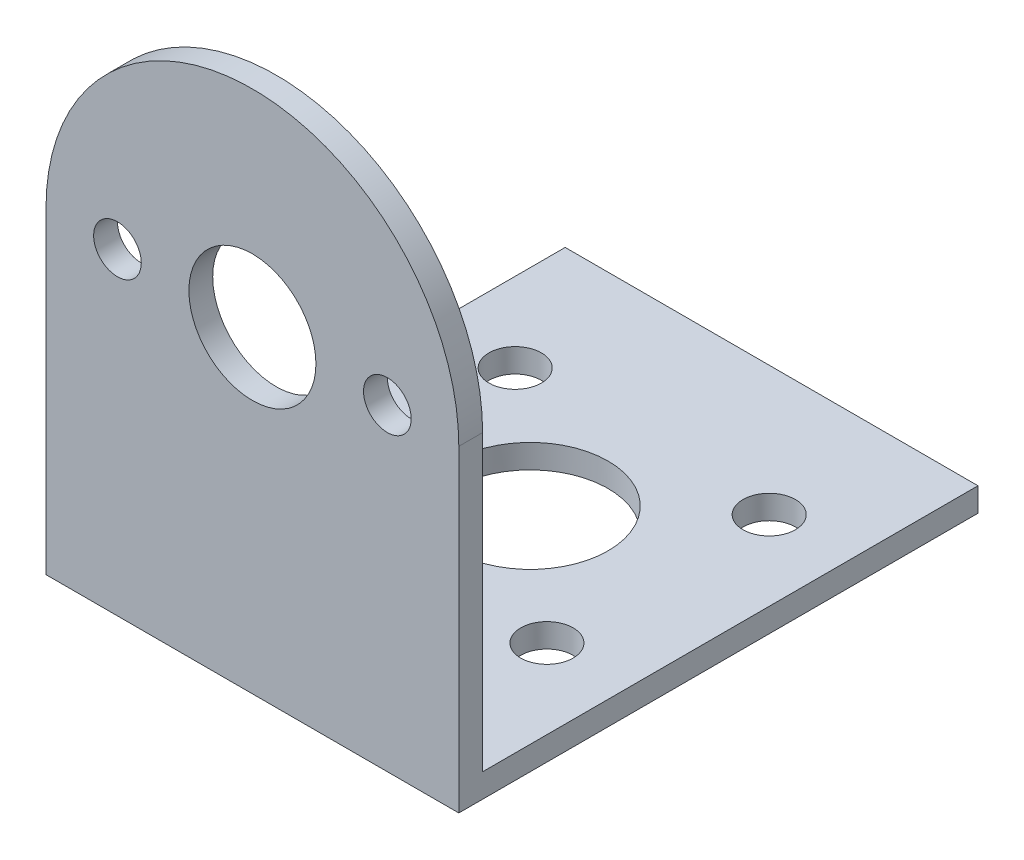
ISO-10303-21;
HEADER;
FILE_DESCRIPTION(('STEP AP214'),'2;1');
FILE_NAME('part.step','',(''),(''),'','','');
FILE_SCHEMA(('AUTOMOTIVE_DESIGN { 1 0 10303 214 1 1 1 1 }'));
ENDSEC;
DATA;
#1=APPLICATION_CONTEXT('core data for automotive mechanical design processes');
#2=APPLICATION_PROTOCOL_DEFINITION('international standard','automotive_design',2000,#1);
#3=PRODUCT_CONTEXT('',#1,'mechanical');
#4=PRODUCT('Part','Part','',(#3));
#5=PRODUCT_RELATED_PRODUCT_CATEGORY('part','',(#4));
#6=PRODUCT_DEFINITION_FORMATION('','',#4);
#7=PRODUCT_DEFINITION_CONTEXT('part definition',#1,'design');
#8=PRODUCT_DEFINITION('design','',#6,#7);
#9=PRODUCT_DEFINITION_SHAPE('','',#8);
#10=(LENGTH_UNIT() NAMED_UNIT(*) SI_UNIT(.MILLI.,.METRE.));
#11=(NAMED_UNIT(*) PLANE_ANGLE_UNIT() SI_UNIT($,.RADIAN.));
#12=(NAMED_UNIT(*) SI_UNIT($,.STERADIAN.) SOLID_ANGLE_UNIT());
#13=UNCERTAINTY_MEASURE_WITH_UNIT(LENGTH_MEASURE(1.E-05),#10,'distance_accuracy_value','');
#14=(GEOMETRIC_REPRESENTATION_CONTEXT(3) GLOBAL_UNCERTAINTY_ASSIGNED_CONTEXT((#13)) GLOBAL_UNIT_ASSIGNED_CONTEXT((#10,
#11,#12)) REPRESENTATION_CONTEXT('',''));
#15=CARTESIAN_POINT('',(0.,0.,0.));
#16=DIRECTION('',(0.,0.,1.));
#17=DIRECTION('',(1.,0.,0.));
#18=AXIS2_PLACEMENT_3D('',#15,#16,#17);
#19=CARTESIAN_POINT('',(0.,-16.7,-29.7));
#20=DIRECTION('',(0.,0.,-1.));
#21=DIRECTION('',(-1.,0.,0.));
#22=AXIS2_PLACEMENT_3D('',#19,#20,#21);
#23=PLANE('',#22);
#24=DIRECTION('',(0.,-1.,0.));
#25=VECTOR('',#24,1.);
#26=CARTESIAN_POINT('',(-13.,-16.7,-29.7));
#27=LINE('',#26,#25);
#28=CARTESIAN_POINT('',(-13.,-18.5,-29.7));
#29=VERTEX_POINT('',#28);
#30=CARTESIAN_POINT('',(-13.,-20.,-29.7));
#31=VERTEX_POINT('',#30);
#32=EDGE_CURVE('E161',#29,#31,#27,.T.);
#33=ORIENTED_EDGE('',*,*,#32,.F.);
#34=DIRECTION('',(-1.,0.,0.));
#35=VECTOR('',#34,1.);
#36=CARTESIAN_POINT('',(13.,-18.5,-29.7));
#37=LINE('',#36,#35);
#38=CARTESIAN_POINT('',(13.,-18.5,-29.7));
#39=VERTEX_POINT('',#38);
#40=EDGE_CURVE('E133',#39,#29,#37,.T.);
#41=ORIENTED_EDGE('',*,*,#40,.F.);
#42=DIRECTION('',(0.,-1.,0.));
#43=VECTOR('',#42,1.);
#44=CARTESIAN_POINT('',(13.,-16.7,-29.7));
#45=LINE('',#44,#43);
#46=CARTESIAN_POINT('',(13.,-20.,-29.7));
#47=VERTEX_POINT('',#46);
#48=EDGE_CURVE('E162',#39,#47,#45,.T.);
#49=ORIENTED_EDGE('',*,*,#48,.T.);
#50=DIRECTION('',(1.,0.,0.));
#51=VECTOR('',#50,1.);
#52=CARTESIAN_POINT('',(0.,-20.,-29.7));
#53=LINE('',#52,#51);
#54=EDGE_CURVE('E155',#31,#47,#53,.T.);
#55=ORIENTED_EDGE('',*,*,#54,.F.);
#56=EDGE_LOOP('',(#33,#41,#49,#55));
#57=FACE_BOUND('',#56,.T.);
#58=ADVANCED_FACE('F37',(#57),#23,.T.);
#59=CARTESIAN_POINT('',(-8.,-16.7,-21.55));
#60=DIRECTION('',(0.,-1.,0.));
#61=DIRECTION('',(1.,0.,0.));
#62=AXIS2_PLACEMENT_3D('',#59,#60,#61);
#63=CYLINDRICAL_SURFACE('',#62,1.65);
#64=CARTESIAN_POINT('',(-8.,-20.,-21.55));
#65=DIRECTION('',(0.,-1.,0.));
#66=DIRECTION('',(1.,0.,0.));
#67=AXIS2_PLACEMENT_3D('',#64,#65,#66);
#68=CIRCLE('',#67,1.65);
#69=CARTESIAN_POINT('',(-6.35,-20.,-21.55));
#70=VERTEX_POINT('',#69);
#71=EDGE_CURVE('E152',#70,#70,#68,.T.);
#72=ORIENTED_EDGE('',*,*,#71,.T.);
#73=EDGE_LOOP('',(#72));
#74=FACE_BOUND('',#73,.T.);
#75=CARTESIAN_POINT('',(-8.,-18.5,-21.55));
#76=DIRECTION('',(0.,1.,0.));
#77=DIRECTION('',(-1.,0.,0.));
#78=AXIS2_PLACEMENT_3D('',#75,#76,#77);
#79=CIRCLE('',#78,1.65);
#80=CARTESIAN_POINT('',(-9.65,-18.5,-21.55));
#81=VERTEX_POINT('',#80);
#82=EDGE_CURVE('E118',#81,#81,#79,.T.);
#83=ORIENTED_EDGE('',*,*,#82,.T.);
#84=EDGE_LOOP('',(#83));
#85=FACE_BOUND('',#84,.T.);
#86=ADVANCED_FACE('F226',(#74,#85),#63,.F.);
#87=CARTESIAN_POINT('',(-8.,-16.7,-7.55));
#88=DIRECTION('',(0.,-1.,0.));
#89=DIRECTION('',(1.,0.,0.));
#90=AXIS2_PLACEMENT_3D('',#87,#88,#89);
#91=CYLINDRICAL_SURFACE('',#90,1.65);
#92=CARTESIAN_POINT('',(-8.,-20.,-7.55));
#93=DIRECTION('',(0.,-1.,0.));
#94=DIRECTION('',(1.,0.,0.));
#95=AXIS2_PLACEMENT_3D('',#92,#93,#94);
#96=CIRCLE('',#95,1.65);
#97=CARTESIAN_POINT('',(-6.35,-20.,-7.55));
#98=VERTEX_POINT('',#97);
#99=EDGE_CURVE('E149',#98,#98,#96,.T.);
#100=ORIENTED_EDGE('',*,*,#99,.T.);
#101=EDGE_LOOP('',(#100));
#102=FACE_BOUND('',#101,.T.);
#103=CARTESIAN_POINT('',(-8.,-18.5,-7.55));
#104=DIRECTION('',(0.,1.,0.));
#105=DIRECTION('',(-1.,0.,0.));
#106=AXIS2_PLACEMENT_3D('',#103,#104,#105);
#107=CIRCLE('',#106,1.65);
#108=CARTESIAN_POINT('',(-9.65000000000001,-18.5,-7.55));
#109=VERTEX_POINT('',#108);
#110=EDGE_CURVE('E127',#109,#109,#107,.T.);
#111=ORIENTED_EDGE('',*,*,#110,.T.);
#112=EDGE_LOOP('',(#111));
#113=FACE_BOUND('',#112,.T.);
#114=ADVANCED_FACE('F221',(#102,#113),#91,.F.);
#115=CARTESIAN_POINT('',(8.,-16.7,-7.55000000000001));
#116=DIRECTION('',(0.,-1.,0.));
#117=DIRECTION('',(1.,0.,0.));
#118=AXIS2_PLACEMENT_3D('',#115,#116,#117);
#119=CYLINDRICAL_SURFACE('',#118,1.65);
#120=CARTESIAN_POINT('',(8.,-20.,-7.55000000000001));
#121=DIRECTION('',(0.,-1.,0.));
#122=DIRECTION('',(1.,0.,0.));
#123=AXIS2_PLACEMENT_3D('',#120,#121,#122);
#124=CIRCLE('',#123,1.65);
#125=CARTESIAN_POINT('',(9.65,-20.,-7.55000000000001));
#126=VERTEX_POINT('',#125);
#127=EDGE_CURVE('E146',#126,#126,#124,.F.);
#128=ORIENTED_EDGE('',*,*,#127,.F.);
#129=EDGE_LOOP('',(#128));
#130=FACE_BOUND('',#129,.T.);
#131=CARTESIAN_POINT('',(7.99999999999999,-18.5,-7.55000000000001));
#132=DIRECTION('',(0.,1.,0.));
#133=DIRECTION('',(-1.,0.,0.));
#134=AXIS2_PLACEMENT_3D('',#131,#132,#133);
#135=CIRCLE('',#134,1.65);
#136=CARTESIAN_POINT('',(6.34999999999999,-18.5,-7.55000000000001));
#137=VERTEX_POINT('',#136);
#138=EDGE_CURVE('E124',#137,#137,#135,.T.);
#139=ORIENTED_EDGE('',*,*,#138,.T.);
#140=EDGE_LOOP('',(#139));
#141=FACE_BOUND('',#140,.T.);
#142=ADVANCED_FACE('F212',(#130,#141),#119,.F.);
#143=CARTESIAN_POINT('',(0.,-16.7,-14.5));
#144=DIRECTION('',(0.,-1.,0.));
#145=DIRECTION('',(1.,0.,0.));
#146=AXIS2_PLACEMENT_3D('',#143,#144,#145);
#147=CYLINDRICAL_SURFACE('',#146,4.9);
#148=CARTESIAN_POINT('',(0.,-20.,-14.5));
#149=DIRECTION('',(0.,-1.,0.));
#150=DIRECTION('',(1.,0.,0.));
#151=AXIS2_PLACEMENT_3D('',#148,#149,#150);
#152=CIRCLE('',#151,4.9);
#153=CARTESIAN_POINT('',(4.9,-20.,-14.5));
#154=VERTEX_POINT('',#153);
#155=EDGE_CURVE('E143',#154,#154,#152,.T.);
#156=ORIENTED_EDGE('',*,*,#155,.T.);
#157=EDGE_LOOP('',(#156));
#158=FACE_BOUND('',#157,.T.);
#159=CARTESIAN_POINT('',(0.,-18.5,-14.5));
#160=DIRECTION('',(0.,1.,0.));
#161=DIRECTION('',(-1.,0.,0.));
#162=AXIS2_PLACEMENT_3D('',#159,#160,#161);
#163=CIRCLE('',#162,4.9);
#164=CARTESIAN_POINT('',(-4.9,-18.5,-14.5));
#165=VERTEX_POINT('',#164);
#166=EDGE_CURVE('E130',#165,#165,#163,.T.);
#167=ORIENTED_EDGE('',*,*,#166,.T.);
#168=EDGE_LOOP('',(#167));
#169=FACE_BOUND('',#168,.T.);
#170=ADVANCED_FACE('F209',(#158,#169),#147,.F.);
#171=CARTESIAN_POINT('',(8.,-16.7,-21.55));
#172=DIRECTION('',(0.,-1.,0.));
#173=DIRECTION('',(1.,0.,0.));
#174=AXIS2_PLACEMENT_3D('',#171,#172,#173);
#175=CYLINDRICAL_SURFACE('',#174,1.65);
#176=CARTESIAN_POINT('',(8.,-20.,-21.55));
#177=DIRECTION('',(0.,-1.,0.));
#178=DIRECTION('',(1.,0.,0.));
#179=AXIS2_PLACEMENT_3D('',#176,#177,#178);
#180=CIRCLE('',#179,1.65);
#181=CARTESIAN_POINT('',(9.65,-20.,-21.55));
#182=VERTEX_POINT('',#181);
#183=EDGE_CURVE('E158',#182,#182,#180,.F.);
#184=ORIENTED_EDGE('',*,*,#183,.F.);
#185=EDGE_LOOP('',(#184));
#186=FACE_BOUND('',#185,.T.);
#187=CARTESIAN_POINT('',(8.,-18.5,-21.55));
#188=DIRECTION('',(0.,1.,0.));
#189=DIRECTION('',(-1.,0.,0.));
#190=AXIS2_PLACEMENT_3D('',#187,#188,#189);
#191=CIRCLE('',#190,1.65);
#192=CARTESIAN_POINT('',(6.35,-18.5,-21.55));
#193=VERTEX_POINT('',#192);
#194=EDGE_CURVE('E121',#193,#193,#191,.T.);
#195=ORIENTED_EDGE('',*,*,#194,.T.);
#196=EDGE_LOOP('',(#195));
#197=FACE_BOUND('',#196,.T.);
#198=ADVANCED_FACE('F211',(#186,#197),#175,.F.);
#199=CARTESIAN_POINT('',(0.,0.,3.));
#200=DIRECTION('',(0.,0.,-1.));
#201=DIRECTION('',(-1.,0.,0.));
#202=AXIS2_PLACEMENT_3D('',#199,#200,#201);
#203=CYLINDRICAL_SURFACE('',#202,13.);
#204=DIRECTION('',(0.,0.,-1.));
#205=VECTOR('',#204,1.);
#206=CARTESIAN_POINT('',(13.,0.,3.));
#207=LINE('',#206,#205);
#208=CARTESIAN_POINT('',(13.,0.,3.));
#209=VERTEX_POINT('',#208);
#210=CARTESIAN_POINT('',(13.,0.,1.5));
#211=VERTEX_POINT('',#210);
#212=EDGE_CURVE('E11',#209,#211,#207,.T.);
#213=ORIENTED_EDGE('',*,*,#212,.T.);
#214=CARTESIAN_POINT('',(0.,0.,1.5));
#215=DIRECTION('',(0.,0.,-1.));
#216=DIRECTION('',(-1.,0.,0.));
#217=AXIS2_PLACEMENT_3D('',#214,#215,#216);
#218=CIRCLE('',#217,13.);
#219=CARTESIAN_POINT('',(-13.,0.,1.5));
#220=VERTEX_POINT('',#219);
#221=EDGE_CURVE('E91',#220,#211,#218,.T.);
#222=ORIENTED_EDGE('',*,*,#221,.F.);
#223=DIRECTION('',(0.,0.,-1.));
#224=VECTOR('',#223,1.);
#225=CARTESIAN_POINT('',(-13.,0.,3.));
#226=LINE('',#225,#224);
#227=CARTESIAN_POINT('',(-13.,0.,3.));
#228=VERTEX_POINT('',#227);
#229=EDGE_CURVE('E45',#228,#220,#226,.T.);
#230=ORIENTED_EDGE('',*,*,#229,.F.);
#231=CARTESIAN_POINT('',(0.,0.,3.));
#232=DIRECTION('',(0.,0.,1.));
#233=DIRECTION('',(1.,0.,0.));
#234=AXIS2_PLACEMENT_3D('',#231,#232,#233);
#235=CIRCLE('',#234,13.);
#236=EDGE_CURVE('E93',#209,#228,#235,.T.);
#237=ORIENTED_EDGE('',*,*,#236,.F.);
#238=EDGE_LOOP('',(#213,#222,#230,#237));
#239=FACE_BOUND('',#238,.T.);
#240=ADVANCED_FACE('F88',(#239),#203,.T.);
#241=CARTESIAN_POINT('',(0.,0.,3.));
#242=DIRECTION('',(0.,0.,-1.));
#243=DIRECTION('',(-1.,0.,0.));
#244=AXIS2_PLACEMENT_3D('',#241,#242,#243);
#245=CYLINDRICAL_SURFACE('',#244,4.);
#246=CARTESIAN_POINT('',(0.,0.,3.));
#247=DIRECTION('',(0.,0.,1.));
#248=DIRECTION('',(1.,0.,0.));
#249=AXIS2_PLACEMENT_3D('',#246,#247,#248);
#250=CIRCLE('',#249,4.);
#251=CARTESIAN_POINT('',(4.,0.,3.));
#252=VERTEX_POINT('',#251);
#253=EDGE_CURVE('E164',#252,#252,#250,.T.);
#254=ORIENTED_EDGE('',*,*,#253,.T.);
#255=EDGE_LOOP('',(#254));
#256=FACE_BOUND('',#255,.T.);
#257=CARTESIAN_POINT('',(0.,0.,1.5));
#258=DIRECTION('',(0.,0.,-1.));
#259=DIRECTION('',(-1.,0.,0.));
#260=AXIS2_PLACEMENT_3D('',#257,#258,#259);
#261=CIRCLE('',#260,4.);
#262=CARTESIAN_POINT('',(-4.,0.,1.5));
#263=VERTEX_POINT('',#262);
#264=EDGE_CURVE('E109',#263,#263,#261,.T.);
#265=ORIENTED_EDGE('',*,*,#264,.T.);
#266=EDGE_LOOP('',(#265));
#267=FACE_BOUND('',#266,.T.);
#268=ADVANCED_FACE('F39',(#256,#267),#245,.F.);
#269=CARTESIAN_POINT('',(-8.5,0.,1.5));
#270=DIRECTION('',(0.,0.,-1.));
#271=DIRECTION('',(-1.,0.,0.));
#272=AXIS2_PLACEMENT_3D('',#269,#270,#271);
#273=CYLINDRICAL_SURFACE('',#272,1.5);
#274=CARTESIAN_POINT('',(-8.5,0.,3.));
#275=DIRECTION('',(0.,0.,1.));
#276=DIRECTION('',(1.,0.,0.));
#277=AXIS2_PLACEMENT_3D('',#274,#275,#276);
#278=CIRCLE('',#277,1.5);
#279=CARTESIAN_POINT('',(-7.,0.,3.));
#280=VERTEX_POINT('',#279);
#281=EDGE_CURVE('E140',#280,#280,#278,.T.);
#282=ORIENTED_EDGE('',*,*,#281,.T.);
#283=EDGE_LOOP('',(#282));
#284=FACE_BOUND('',#283,.T.);
#285=CARTESIAN_POINT('',(-8.5,0.,1.5));
#286=DIRECTION('',(0.,0.,-1.));
#287=DIRECTION('',(-1.,0.,0.));
#288=AXIS2_PLACEMENT_3D('',#285,#286,#287);
#289=CIRCLE('',#288,1.5);
#290=CARTESIAN_POINT('',(-10.,0.,1.5));
#291=VERTEX_POINT('',#290);
#292=EDGE_CURVE('E275',#291,#291,#289,.T.);
#293=ORIENTED_EDGE('',*,*,#292,.T.);
#294=EDGE_LOOP('',(#293));
#295=FACE_BOUND('',#294,.T.);
#296=ADVANCED_FACE('F264',(#284,#295),#273,.F.);
#297=CARTESIAN_POINT('',(8.5,0.,1.5));
#298=DIRECTION('',(0.,0.,-1.));
#299=DIRECTION('',(-1.,0.,0.));
#300=AXIS2_PLACEMENT_3D('',#297,#298,#299);
#301=CYLINDRICAL_SURFACE('',#300,1.5);
#302=CARTESIAN_POINT('',(8.5,0.,3.));
#303=DIRECTION('',(0.,0.,1.));
#304=DIRECTION('',(1.,0.,0.));
#305=AXIS2_PLACEMENT_3D('',#302,#303,#304);
#306=CIRCLE('',#305,1.5);
#307=CARTESIAN_POINT('',(10.,0.,3.));
#308=VERTEX_POINT('',#307);
#309=EDGE_CURVE('E137',#308,#308,#306,.T.);
#310=ORIENTED_EDGE('',*,*,#309,.T.);
#311=EDGE_LOOP('',(#310));
#312=FACE_BOUND('',#311,.T.);
#313=CARTESIAN_POINT('',(8.5,0.,1.5));
#314=DIRECTION('',(0.,0.,-1.));
#315=DIRECTION('',(-1.,0.,0.));
#316=AXIS2_PLACEMENT_3D('',#313,#314,#315);
#317=CIRCLE('',#316,1.5);
#318=CARTESIAN_POINT('',(7.,0.,1.5));
#319=VERTEX_POINT('',#318);
#320=EDGE_CURVE('E112',#319,#319,#317,.T.);
#321=ORIENTED_EDGE('',*,*,#320,.T.);
#322=EDGE_LOOP('',(#321));
#323=FACE_BOUND('',#322,.T.);
#324=ADVANCED_FACE('F260',(#312,#323),#301,.F.);
#325=CARTESIAN_POINT('',(13.,0.,3.));
#326=DIRECTION('',(1.,0.,0.));
#327=DIRECTION('',(0.,1.,0.));
#328=AXIS2_PLACEMENT_3D('',#325,#326,#327);
#329=PLANE('',#328);
#330=DIRECTION('',(0.,0.,-1.));
#331=VECTOR('',#330,1.);
#332=CARTESIAN_POINT('',(13.,-18.5,1.8));
#333=LINE('',#332,#331);
#334=CARTESIAN_POINT('',(13.,-18.5,1.5));
#335=VERTEX_POINT('',#334);
#336=EDGE_CURVE('E101',#335,#39,#333,.T.);
#337=ORIENTED_EDGE('',*,*,#336,.F.);
#338=DIRECTION('',(0.,-1.,0.));
#339=VECTOR('',#338,1.);
#340=CARTESIAN_POINT('',(13.,0.,1.5));
#341=LINE('',#340,#339);
#342=EDGE_CURVE('E98',#211,#335,#341,.T.);
#343=ORIENTED_EDGE('',*,*,#342,.F.);
#344=ORIENTED_EDGE('',*,*,#212,.F.);
#345=DIRECTION('',(0.,-1.,0.));
#346=VECTOR('',#345,1.);
#347=CARTESIAN_POINT('',(13.,0.,3.));
#348=LINE('',#347,#346);
#349=CARTESIAN_POINT('',(13.,-20.,3.));
#350=VERTEX_POINT('',#349);
#351=EDGE_CURVE('E168',#209,#350,#348,.T.);
#352=ORIENTED_EDGE('',*,*,#351,.T.);
#353=DIRECTION('',(0.,0.,-1.));
#354=VECTOR('',#353,1.);
#355=CARTESIAN_POINT('',(13.,-20.,3.));
#356=LINE('',#355,#354);
#357=EDGE_CURVE('E176',#350,#47,#356,.T.);
#358=ORIENTED_EDGE('',*,*,#357,.T.);
#359=ORIENTED_EDGE('',*,*,#48,.F.);
#360=EDGE_LOOP('',(#337,#343,#344,#352,#358,#359));
#361=FACE_BOUND('',#360,.T.);
#362=ADVANCED_FACE('F99',(#361),#329,.T.);
#363=CARTESIAN_POINT('',(-13.,0.,3.));
#364=DIRECTION('',(1.,0.,0.));
#365=DIRECTION('',(0.,1.,0.));
#366=AXIS2_PLACEMENT_3D('',#363,#364,#365);
#367=PLANE('',#366);
#368=ORIENTED_EDGE('',*,*,#229,.T.);
#369=DIRECTION('',(0.,1.,0.));
#370=VECTOR('',#369,1.);
#371=CARTESIAN_POINT('',(-13.,-18.5,1.5));
#372=LINE('',#371,#370);
#373=CARTESIAN_POINT('',(-13.,-18.5,1.5));
#374=VERTEX_POINT('',#373);
#375=EDGE_CURVE('E108',#374,#220,#372,.T.);
#376=ORIENTED_EDGE('',*,*,#375,.F.);
#377=DIRECTION('',(0.,0.,1.));
#378=VECTOR('',#377,1.);
#379=CARTESIAN_POINT('',(-13.,-18.5,-29.7));
#380=LINE('',#379,#378);
#381=EDGE_CURVE('E57',#29,#374,#380,.T.);
#382=ORIENTED_EDGE('',*,*,#381,.F.);
#383=ORIENTED_EDGE('',*,*,#32,.T.);
#384=DIRECTION('',(0.,0.,-1.));
#385=VECTOR('',#384,1.);
#386=CARTESIAN_POINT('',(-13.,-20.,3.));
#387=LINE('',#386,#385);
#388=CARTESIAN_POINT('',(-13.,-20.,3.));
#389=VERTEX_POINT('',#388);
#390=EDGE_CURVE('E179',#389,#31,#387,.T.);
#391=ORIENTED_EDGE('',*,*,#390,.F.);
#392=DIRECTION('',(0.,-1.,0.));
#393=VECTOR('',#392,1.);
#394=CARTESIAN_POINT('',(-13.,0.,3.));
#395=LINE('',#394,#393);
#396=EDGE_CURVE('E171',#228,#389,#395,.T.);
#397=ORIENTED_EDGE('',*,*,#396,.F.);
#398=EDGE_LOOP('',(#368,#376,#382,#383,#391,#397));
#399=FACE_BOUND('',#398,.T.);
#400=ADVANCED_FACE('F182',(#399),#367,.F.);
#401=CARTESIAN_POINT('',(0.,-20.,3.));
#402=DIRECTION('',(0.,1.,0.));
#403=DIRECTION('',(0.,0.,1.));
#404=AXIS2_PLACEMENT_3D('',#401,#402,#403);
#405=PLANE('',#404);
#406=ORIENTED_EDGE('',*,*,#390,.T.);
#407=ORIENTED_EDGE('',*,*,#54,.T.);
#408=ORIENTED_EDGE('',*,*,#357,.F.);
#409=DIRECTION('',(1.,0.,0.));
#410=VECTOR('',#409,1.);
#411=CARTESIAN_POINT('',(0.,-20.,3.));
#412=LINE('',#411,#410);
#413=EDGE_CURVE('E174',#389,#350,#412,.T.);
#414=ORIENTED_EDGE('',*,*,#413,.F.);
#415=EDGE_LOOP('',(#406,#407,#408,#414));
#416=FACE_BOUND('',#415,.T.);
#417=ORIENTED_EDGE('',*,*,#155,.F.);
#418=EDGE_LOOP('',(#417));
#419=FACE_BOUND('',#418,.T.);
#420=ORIENTED_EDGE('',*,*,#127,.T.);
#421=EDGE_LOOP('',(#420));
#422=FACE_BOUND('',#421,.T.);
#423=ORIENTED_EDGE('',*,*,#99,.F.);
#424=EDGE_LOOP('',(#423));
#425=FACE_BOUND('',#424,.T.);
#426=ORIENTED_EDGE('',*,*,#71,.F.);
#427=EDGE_LOOP('',(#426));
#428=FACE_BOUND('',#427,.T.);
#429=ORIENTED_EDGE('',*,*,#183,.T.);
#430=EDGE_LOOP('',(#429));
#431=FACE_BOUND('',#430,.T.);
#432=ADVANCED_FACE('F190',(#416,#419,#422,#425,#428,#431),#405,.F.);
#433=CARTESIAN_POINT('',(0.,0.,3.));
#434=DIRECTION('',(0.,0.,1.));
#435=DIRECTION('',(1.,0.,0.));
#436=AXIS2_PLACEMENT_3D('',#433,#434,#435);
#437=PLANE('',#436);
#438=ORIENTED_EDGE('',*,*,#253,.F.);
#439=EDGE_LOOP('',(#438));
#440=FACE_BOUND('',#439,.T.);
#441=ORIENTED_EDGE('',*,*,#351,.F.);
#442=ORIENTED_EDGE('',*,*,#236,.T.);
#443=ORIENTED_EDGE('',*,*,#396,.T.);
#444=ORIENTED_EDGE('',*,*,#413,.T.);
#445=EDGE_LOOP('',(#441,#442,#443,#444));
#446=FACE_BOUND('',#445,.T.);
#447=ORIENTED_EDGE('',*,*,#281,.F.);
#448=EDGE_LOOP('',(#447));
#449=FACE_BOUND('',#448,.T.);
#450=ORIENTED_EDGE('',*,*,#309,.F.);
#451=EDGE_LOOP('',(#450));
#452=FACE_BOUND('',#451,.T.);
#453=ADVANCED_FACE('F185',(#440,#446,#449,#452),#437,.T.);
#454=CARTESIAN_POINT('',(0.,-18.5,0.));
#455=DIRECTION('',(0.,1.,0.));
#456=DIRECTION('',(0.,0.,1.));
#457=AXIS2_PLACEMENT_3D('',#454,#455,#456);
#458=PLANE('',#457);
#459=DIRECTION('',(-1.,0.,0.));
#460=VECTOR('',#459,1.);
#461=CARTESIAN_POINT('',(13.,-18.5,1.5));
#462=LINE('',#461,#460);
#463=EDGE_CURVE('E52',#335,#374,#462,.T.);
#464=ORIENTED_EDGE('',*,*,#463,.F.);
#465=ORIENTED_EDGE('',*,*,#336,.T.);
#466=ORIENTED_EDGE('',*,*,#40,.T.);
#467=ORIENTED_EDGE('',*,*,#381,.T.);
#468=EDGE_LOOP('',(#464,#465,#466,#467));
#469=FACE_BOUND('',#468,.T.);
#470=ORIENTED_EDGE('',*,*,#82,.F.);
#471=EDGE_LOOP('',(#470));
#472=FACE_BOUND('',#471,.T.);
#473=ORIENTED_EDGE('',*,*,#194,.F.);
#474=EDGE_LOOP('',(#473));
#475=FACE_BOUND('',#474,.T.);
#476=ORIENTED_EDGE('',*,*,#138,.F.);
#477=EDGE_LOOP('',(#476));
#478=FACE_BOUND('',#477,.T.);
#479=ORIENTED_EDGE('',*,*,#110,.F.);
#480=EDGE_LOOP('',(#479));
#481=FACE_BOUND('',#480,.T.);
#482=ORIENTED_EDGE('',*,*,#166,.F.);
#483=EDGE_LOOP('',(#482));
#484=FACE_BOUND('',#483,.T.);
#485=ADVANCED_FACE('F195',(#469,#472,#475,#478,#481,#484),#458,.T.);
#486=CARTESIAN_POINT('',(0.,0.,1.5));
#487=DIRECTION('',(0.,0.,-1.));
#488=DIRECTION('',(-1.,0.,0.));
#489=AXIS2_PLACEMENT_3D('',#486,#487,#488);
#490=PLANE('',#489);
#491=ORIENTED_EDGE('',*,*,#320,.F.);
#492=EDGE_LOOP('',(#491));
#493=FACE_BOUND('',#492,.T.);
#494=ORIENTED_EDGE('',*,*,#221,.T.);
#495=ORIENTED_EDGE('',*,*,#342,.T.);
#496=ORIENTED_EDGE('',*,*,#463,.T.);
#497=ORIENTED_EDGE('',*,*,#375,.T.);
#498=EDGE_LOOP('',(#494,#495,#496,#497));
#499=FACE_BOUND('',#498,.T.);
#500=ORIENTED_EDGE('',*,*,#264,.F.);
#501=EDGE_LOOP('',(#500));
#502=FACE_BOUND('',#501,.T.);
#503=ORIENTED_EDGE('',*,*,#292,.F.);
#504=EDGE_LOOP('',(#503));
#505=FACE_BOUND('',#504,.T.);
#506=ADVANCED_FACE('F105',(#493,#499,#502,#505),#490,.T.);
#507=CLOSED_SHELL('',(#58,#86,#114,#142,#170,#198,#240,#268,#296,#324,#362,#400,#432,#453,#485,#506));
#508=MANIFOLD_SOLID_BREP('B2',#507);
#509=ADVANCED_BREP_SHAPE_REPRESENTATION('',(#18,#508),#14);
#510=SHAPE_DEFINITION_REPRESENTATION(#9,#509);
ENDSEC;
END-ISO-10303-21;
